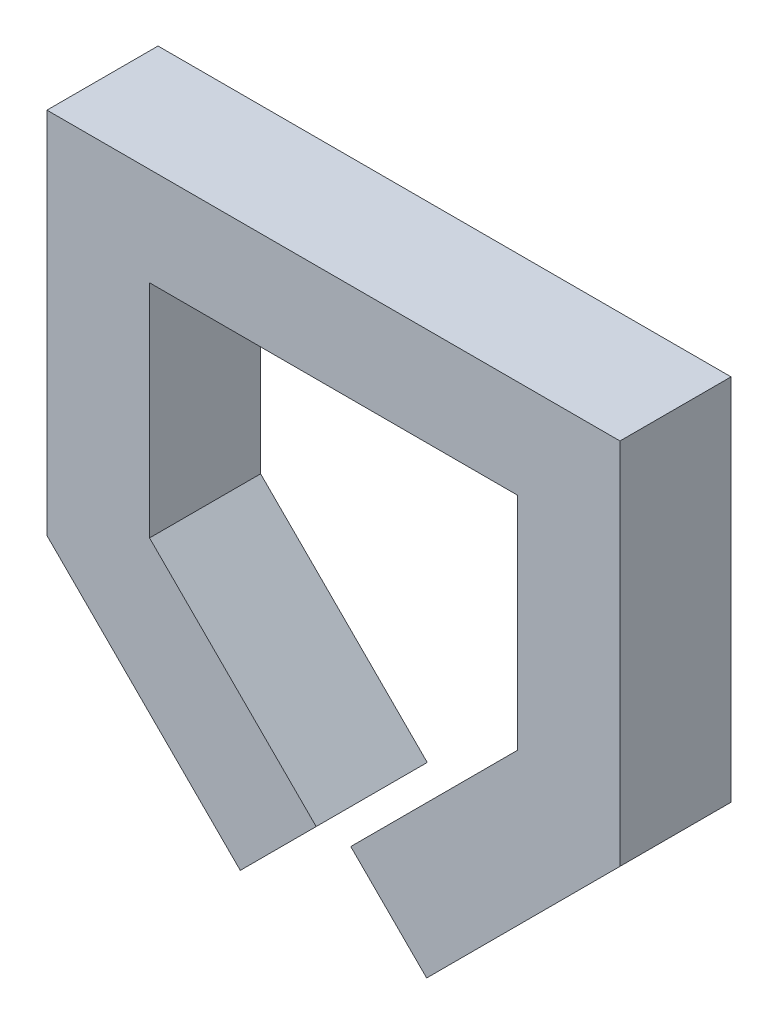
ISO-10303-21;
HEADER;
FILE_DESCRIPTION(('STEP AP214'),'2;1');
FILE_NAME('part.step','',(''),(''),'','','');
FILE_SCHEMA(('AUTOMOTIVE_DESIGN { 1 0 10303 214 1 1 1 1 }'));
ENDSEC;
DATA;
#1=APPLICATION_CONTEXT('core data for automotive mechanical design processes');
#2=APPLICATION_PROTOCOL_DEFINITION('international standard','automotive_design',2000,#1);
#3=PRODUCT_CONTEXT('',#1,'mechanical');
#4=PRODUCT('Part','Part','',(#3));
#5=PRODUCT_RELATED_PRODUCT_CATEGORY('part','',(#4));
#6=PRODUCT_DEFINITION_FORMATION('','',#4);
#7=PRODUCT_DEFINITION_CONTEXT('part definition',#1,'design');
#8=PRODUCT_DEFINITION('design','',#6,#7);
#9=PRODUCT_DEFINITION_SHAPE('','',#8);
#10=(LENGTH_UNIT() NAMED_UNIT(*) SI_UNIT(.MILLI.,.METRE.));
#11=(NAMED_UNIT(*) PLANE_ANGLE_UNIT() SI_UNIT($,.RADIAN.));
#12=(NAMED_UNIT(*) SI_UNIT($,.STERADIAN.) SOLID_ANGLE_UNIT());
#13=UNCERTAINTY_MEASURE_WITH_UNIT(LENGTH_MEASURE(1.E-05),#10,'distance_accuracy_value','');
#14=(GEOMETRIC_REPRESENTATION_CONTEXT(3) GLOBAL_UNCERTAINTY_ASSIGNED_CONTEXT((#13)) GLOBAL_UNIT_ASSIGNED_CONTEXT((#10,
#11,#12)) REPRESENTATION_CONTEXT('',''));
#15=CARTESIAN_POINT('',(0.,0.,0.));
#16=DIRECTION('',(0.,0.,1.));
#17=DIRECTION('',(1.,0.,0.));
#18=AXIS2_PLACEMENT_3D('',#15,#16,#17);
#19=CARTESIAN_POINT('',(86.4478070884838,-20.1310186947394,20.));
#20=DIRECTION('',(-1.,0.,0.));
#21=DIRECTION('',(0.,0.,1.));
#22=AXIS2_PLACEMENT_3D('',#19,#20,#21);
#23=PLANE('',#22);
#24=DIRECTION('',(0.,1.,0.));
#25=VECTOR('',#24,1.);
#26=CARTESIAN_POINT('',(86.4478070884838,-20.1310186947394,0.));
#27=LINE('',#26,#25);
#28=CARTESIAN_POINT('',(86.4478070884838,-20.1310186947394,0.));
#29=VERTEX_POINT('',#28);
#30=CARTESIAN_POINT('',(86.4478070884838,46.2157099251284,0.));
#31=VERTEX_POINT('',#30);
#32=EDGE_CURVE('E153',#29,#31,#27,.T.);
#33=ORIENTED_EDGE('',*,*,#32,.F.);
#34=DIRECTION('',(0.,0.,-1.));
#35=VECTOR('',#34,1.);
#36=CARTESIAN_POINT('',(86.4478070884838,-20.1310186947394,20.));
#37=LINE('',#36,#35);
#38=CARTESIAN_POINT('',(86.4478070884838,-20.1310186947394,20.));
#39=VERTEX_POINT('',#38);
#40=EDGE_CURVE('E11',#39,#29,#37,.T.);
#41=ORIENTED_EDGE('',*,*,#40,.F.);
#42=DIRECTION('',(0.,1.,0.));
#43=VECTOR('',#42,1.);
#44=CARTESIAN_POINT('',(86.4478070884838,-20.1310186947394,20.));
#45=LINE('',#44,#43);
#46=CARTESIAN_POINT('',(86.4478070884838,46.2157099251284,20.));
#47=VERTEX_POINT('',#46);
#48=EDGE_CURVE('E183',#39,#47,#45,.T.);
#49=ORIENTED_EDGE('',*,*,#48,.T.);
#50=DIRECTION('',(0.,0.,-1.));
#51=VECTOR('',#50,1.);
#52=CARTESIAN_POINT('',(86.4478070884838,46.2157099251284,20.));
#53=LINE('',#52,#51);
#54=EDGE_CURVE('E36',#47,#31,#53,.T.);
#55=ORIENTED_EDGE('',*,*,#54,.T.);
#56=EDGE_LOOP('',(#33,#41,#49,#55));
#57=FACE_BOUND('',#56,.T.);
#58=ADVANCED_FACE('F33',(#57),#23,.T.);
#59=CARTESIAN_POINT('',(121.262122634224,-54.9453342404804,20.));
#60=DIRECTION('',(-0.707106781186554,-0.707106781186541,0.));
#61=DIRECTION('',(0.707106781186541,-0.707106781186554,0.));
#62=AXIS2_PLACEMENT_3D('',#59,#60,#61);
#63=PLANE('',#62);
#64=DIRECTION('',(-0.707106781186541,0.707106781186554,0.));
#65=VECTOR('',#64,1.);
#66=CARTESIAN_POINT('',(121.262122634224,-54.9453342404804,0.));
#67=LINE('',#66,#65);
#68=CARTESIAN_POINT('',(121.262122634224,-54.9453342404804,0.));
#69=VERTEX_POINT('',#68);
#70=EDGE_CURVE('E181',#69,#29,#67,.T.);
#71=ORIENTED_EDGE('',*,*,#70,.F.);
#72=DIRECTION('',(0.,0.,-1.));
#73=VECTOR('',#72,1.);
#74=CARTESIAN_POINT('',(121.262122634224,-54.9453342404804,20.));
#75=LINE('',#74,#73);
#76=CARTESIAN_POINT('',(121.262122634224,-54.9453342404804,20.));
#77=VERTEX_POINT('',#76);
#78=EDGE_CURVE('E42',#77,#69,#75,.T.);
#79=ORIENTED_EDGE('',*,*,#78,.F.);
#80=DIRECTION('',(-0.707106781186541,0.707106781186554,0.));
#81=VECTOR('',#80,1.);
#82=CARTESIAN_POINT('',(121.262122634224,-54.9453342404804,20.));
#83=LINE('',#82,#81);
#84=EDGE_CURVE('E133',#77,#39,#83,.T.);
#85=ORIENTED_EDGE('',*,*,#84,.T.);
#86=ORIENTED_EDGE('',*,*,#40,.T.);
#87=EDGE_LOOP('',(#71,#79,#85,#86));
#88=FACE_BOUND('',#87,.T.);
#89=ADVANCED_FACE('F206',(#88),#63,.T.);
#90=CARTESIAN_POINT('',(121.262122634224,-54.9453342404804,20.));
#91=DIRECTION('',(-0.707106781186547,0.707106781186548,0.));
#92=DIRECTION('',(-0.707106781186548,-0.707106781186547,0.));
#93=AXIS2_PLACEMENT_3D('',#90,#91,#92);
#94=PLANE('',#93);
#95=DIRECTION('',(0.707106781186548,0.707106781186547,0.));
#96=VECTOR('',#95,1.);
#97=CARTESIAN_POINT('',(121.262122634224,-54.9453342404804,0.));
#98=LINE('',#97,#96);
#99=CARTESIAN_POINT('',(134.930162854027,-41.2772940206779,0.));
#100=VERTEX_POINT('',#99);
#101=EDGE_CURVE('E138',#69,#100,#98,.T.);
#102=ORIENTED_EDGE('',*,*,#101,.T.);
#103=DIRECTION('',(0.,0.,-1.));
#104=VECTOR('',#103,1.);
#105=CARTESIAN_POINT('',(134.930162854027,-41.2772940206779,20.));
#106=LINE('',#105,#104);
#107=CARTESIAN_POINT('',(134.930162854027,-41.2772940206779,20.));
#108=VERTEX_POINT('',#107);
#109=EDGE_CURVE('E136',#108,#100,#106,.T.);
#110=ORIENTED_EDGE('',*,*,#109,.F.);
#111=DIRECTION('',(0.707106781186548,0.707106781186547,0.));
#112=VECTOR('',#111,1.);
#113=CARTESIAN_POINT('',(121.262122634224,-54.9453342404804,20.));
#114=LINE('',#113,#112);
#115=EDGE_CURVE('E127',#77,#108,#114,.T.);
#116=ORIENTED_EDGE('',*,*,#115,.F.);
#117=ORIENTED_EDGE('',*,*,#78,.T.);
#118=EDGE_LOOP('',(#102,#110,#116,#117));
#119=FACE_BOUND('',#118,.T.);
#120=ADVANCED_FACE('F137',(#119),#94,.F.);
#121=CARTESIAN_POINT('',(134.930162854027,-41.2772940206779,20.));
#122=DIRECTION('',(-0.707106781186547,-0.707106781186548,0.));
#123=DIRECTION('',(0.707106781186548,-0.707106781186547,0.));
#124=AXIS2_PLACEMENT_3D('',#121,#122,#123);
#125=PLANE('',#124);
#126=DIRECTION('',(-0.707106781186548,0.707106781186547,0.));
#127=VECTOR('',#126,1.);
#128=CARTESIAN_POINT('',(134.930162854027,-41.2772940206779,0.));
#129=LINE('',#128,#127);
#130=CARTESIAN_POINT('',(104.920992701013,-11.2681238676647,0.));
#131=VERTEX_POINT('',#130);
#132=EDGE_CURVE('E178',#100,#131,#129,.T.);
#133=ORIENTED_EDGE('',*,*,#132,.T.);
#134=DIRECTION('',(0.,0.,-1.));
#135=VECTOR('',#134,1.);
#136=CARTESIAN_POINT('',(104.920992701013,-11.2681238676647,20.));
#137=LINE('',#136,#135);
#138=CARTESIAN_POINT('',(104.920992701013,-11.2681238676647,20.));
#139=VERTEX_POINT('',#138);
#140=EDGE_CURVE('E141',#139,#131,#137,.T.);
#141=ORIENTED_EDGE('',*,*,#140,.F.);
#142=DIRECTION('',(-0.707106781186548,0.707106781186547,0.));
#143=VECTOR('',#142,1.);
#144=CARTESIAN_POINT('',(134.930162854027,-41.2772940206779,20.));
#145=LINE('',#144,#143);
#146=EDGE_CURVE('E131',#108,#139,#145,.T.);
#147=ORIENTED_EDGE('',*,*,#146,.F.);
#148=ORIENTED_EDGE('',*,*,#109,.T.);
#149=EDGE_LOOP('',(#133,#141,#147,#148));
#150=FACE_BOUND('',#149,.T.);
#151=ADVANCED_FACE('F143',(#150),#125,.F.);
#152=CARTESIAN_POINT('',(104.920992701013,-11.2681238676647,20.));
#153=DIRECTION('',(-1.,0.,0.));
#154=DIRECTION('',(0.,0.,1.));
#155=AXIS2_PLACEMENT_3D('',#152,#153,#154);
#156=PLANE('',#155);
#157=DIRECTION('',(0.,1.,0.));
#158=VECTOR('',#157,1.);
#159=CARTESIAN_POINT('',(104.920992701013,-11.2681238676647,0.));
#160=LINE('',#159,#158);
#161=CARTESIAN_POINT('',(104.920992701013,28.5298559303157,0.));
#162=VERTEX_POINT('',#161);
#163=EDGE_CURVE('E176',#131,#162,#160,.T.);
#164=ORIENTED_EDGE('',*,*,#163,.T.);
#165=DIRECTION('',(0.,0.,-1.));
#166=VECTOR('',#165,1.);
#167=CARTESIAN_POINT('',(104.920992701013,28.5298559303157,20.));
#168=LINE('',#167,#166);
#169=CARTESIAN_POINT('',(104.920992701013,28.5298559303157,20.));
#170=VERTEX_POINT('',#169);
#171=EDGE_CURVE('E187',#170,#162,#168,.T.);
#172=ORIENTED_EDGE('',*,*,#171,.F.);
#173=DIRECTION('',(0.,1.,0.));
#174=VECTOR('',#173,1.);
#175=CARTESIAN_POINT('',(104.920992701013,-11.2681238676647,20.));
#176=LINE('',#175,#174);
#177=EDGE_CURVE('E146',#139,#170,#176,.T.);
#178=ORIENTED_EDGE('',*,*,#177,.F.);
#179=ORIENTED_EDGE('',*,*,#140,.T.);
#180=EDGE_LOOP('',(#164,#172,#178,#179));
#181=FACE_BOUND('',#180,.T.);
#182=ADVANCED_FACE('F219',(#181),#156,.F.);
#183=CARTESIAN_POINT('',(104.920992701013,28.5298559303157,20.));
#184=DIRECTION('',(0.,1.,0.));
#185=DIRECTION('',(-1.,0.,0.));
#186=AXIS2_PLACEMENT_3D('',#183,#184,#185);
#187=PLANE('',#186);
#188=DIRECTION('',(1.,0.,0.));
#189=VECTOR('',#188,1.);
#190=CARTESIAN_POINT('',(104.920992701013,28.5298559303157,0.));
#191=LINE('',#190,#189);
#192=CARTESIAN_POINT('',(171.166129255041,28.5298559303157,0.));
#193=VERTEX_POINT('',#192);
#194=EDGE_CURVE('E173',#162,#193,#191,.T.);
#195=ORIENTED_EDGE('',*,*,#194,.T.);
#196=DIRECTION('',(0.,0.,-1.));
#197=VECTOR('',#196,1.);
#198=CARTESIAN_POINT('',(171.166129255041,28.5298559303157,20.));
#199=LINE('',#198,#197);
#200=CARTESIAN_POINT('',(171.166129255041,28.5298559303157,20.));
#201=VERTEX_POINT('',#200);
#202=EDGE_CURVE('E190',#201,#193,#199,.T.);
#203=ORIENTED_EDGE('',*,*,#202,.F.);
#204=DIRECTION('',(1.,0.,0.));
#205=VECTOR('',#204,1.);
#206=CARTESIAN_POINT('',(104.920992701013,28.5298559303157,20.));
#207=LINE('',#206,#205);
#208=EDGE_CURVE('E148',#170,#201,#207,.T.);
#209=ORIENTED_EDGE('',*,*,#208,.F.);
#210=ORIENTED_EDGE('',*,*,#171,.T.);
#211=EDGE_LOOP('',(#195,#203,#209,#210));
#212=FACE_BOUND('',#211,.T.);
#213=ADVANCED_FACE('F222',(#212),#187,.F.);
#214=CARTESIAN_POINT('',(171.166129255041,-11.2681238676647,20.));
#215=DIRECTION('',(-1.,0.,0.));
#216=DIRECTION('',(0.,0.,1.));
#217=AXIS2_PLACEMENT_3D('',#214,#215,#216);
#218=PLANE('',#217);
#219=DIRECTION('',(0.,1.,0.));
#220=VECTOR('',#219,1.);
#221=CARTESIAN_POINT('',(171.166129255041,-11.2681238676647,0.));
#222=LINE('',#221,#220);
#223=CARTESIAN_POINT('',(171.166129255041,-11.2681238676647,0.));
#224=VERTEX_POINT('',#223);
#225=EDGE_CURVE('E170',#224,#193,#222,.T.);
#226=ORIENTED_EDGE('',*,*,#225,.F.);
#227=DIRECTION('',(0.,0.,-1.));
#228=VECTOR('',#227,1.);
#229=CARTESIAN_POINT('',(171.166129255041,-11.2681238676647,20.));
#230=LINE('',#229,#228);
#231=CARTESIAN_POINT('',(171.166129255041,-11.2681238676647,20.));
#232=VERTEX_POINT('',#231);
#233=EDGE_CURVE('E192',#232,#224,#230,.T.);
#234=ORIENTED_EDGE('',*,*,#233,.F.);
#235=DIRECTION('',(0.,1.,0.));
#236=VECTOR('',#235,1.);
#237=CARTESIAN_POINT('',(171.166129255041,-11.2681238676647,20.));
#238=LINE('',#237,#236);
#239=EDGE_CURVE('E348',#232,#201,#238,.T.);
#240=ORIENTED_EDGE('',*,*,#239,.T.);
#241=ORIENTED_EDGE('',*,*,#202,.T.);
#242=EDGE_LOOP('',(#226,#234,#240,#241));
#243=FACE_BOUND('',#242,.T.);
#244=ADVANCED_FACE('F226',(#243),#218,.T.);
#245=CARTESIAN_POINT('',(141.156959102028,-41.2772940206779,20.));
#246=DIRECTION('',(-0.707106781186547,0.707106781186548,0.));
#247=DIRECTION('',(-0.707106781186548,-0.707106781186547,0.));
#248=AXIS2_PLACEMENT_3D('',#245,#246,#247);
#249=PLANE('',#248);
#250=DIRECTION('',(0.707106781186548,0.707106781186547,0.));
#251=VECTOR('',#250,1.);
#252=CARTESIAN_POINT('',(141.156959102028,-41.2772940206779,0.));
#253=LINE('',#252,#251);
#254=CARTESIAN_POINT('',(141.156959102028,-41.2772940206779,0.));
#255=VERTEX_POINT('',#254);
#256=EDGE_CURVE('E167',#255,#224,#253,.T.);
#257=ORIENTED_EDGE('',*,*,#256,.F.);
#258=DIRECTION('',(0.,0.,-1.));
#259=VECTOR('',#258,1.);
#260=CARTESIAN_POINT('',(141.156959102028,-41.2772940206779,20.));
#261=LINE('',#260,#259);
#262=CARTESIAN_POINT('',(141.156959102028,-41.2772940206779,20.));
#263=VERTEX_POINT('',#262);
#264=EDGE_CURVE('E194',#263,#255,#261,.T.);
#265=ORIENTED_EDGE('',*,*,#264,.F.);
#266=DIRECTION('',(0.707106781186548,0.707106781186547,0.));
#267=VECTOR('',#266,1.);
#268=CARTESIAN_POINT('',(141.156959102028,-41.2772940206779,20.));
#269=LINE('',#268,#267);
#270=EDGE_CURVE('E351',#263,#232,#269,.T.);
#271=ORIENTED_EDGE('',*,*,#270,.T.);
#272=ORIENTED_EDGE('',*,*,#233,.T.);
#273=EDGE_LOOP('',(#257,#265,#271,#272));
#274=FACE_BOUND('',#273,.T.);
#275=ADVANCED_FACE('F230',(#274),#249,.T.);
#276=CARTESIAN_POINT('',(154.82499932183,-54.9453342404801,20.));
#277=DIRECTION('',(-0.707106781186547,-0.707106781186548,0.));
#278=DIRECTION('',(0.707106781186548,-0.707106781186547,0.));
#279=AXIS2_PLACEMENT_3D('',#276,#277,#278);
#280=PLANE('',#279);
#281=DIRECTION('',(-0.707106781186548,0.707106781186547,0.));
#282=VECTOR('',#281,1.);
#283=CARTESIAN_POINT('',(154.82499932183,-54.9453342404801,0.));
#284=LINE('',#283,#282);
#285=CARTESIAN_POINT('',(154.82499932183,-54.9453342404801,0.));
#286=VERTEX_POINT('',#285);
#287=EDGE_CURVE('E164',#286,#255,#284,.T.);
#288=ORIENTED_EDGE('',*,*,#287,.F.);
#289=DIRECTION('',(0.,0.,-1.));
#290=VECTOR('',#289,1.);
#291=CARTESIAN_POINT('',(154.82499932183,-54.9453342404801,20.));
#292=LINE('',#291,#290);
#293=CARTESIAN_POINT('',(154.82499932183,-54.9453342404801,20.));
#294=VERTEX_POINT('',#293);
#295=EDGE_CURVE('E196',#294,#286,#292,.T.);
#296=ORIENTED_EDGE('',*,*,#295,.F.);
#297=DIRECTION('',(-0.707106781186548,0.707106781186547,0.));
#298=VECTOR('',#297,1.);
#299=CARTESIAN_POINT('',(154.82499932183,-54.9453342404801,20.));
#300=LINE('',#299,#298);
#301=EDGE_CURVE('E339',#294,#263,#300,.T.);
#302=ORIENTED_EDGE('',*,*,#301,.T.);
#303=ORIENTED_EDGE('',*,*,#264,.T.);
#304=EDGE_LOOP('',(#288,#296,#302,#303));
#305=FACE_BOUND('',#304,.T.);
#306=ADVANCED_FACE('F234',(#305),#280,.T.);
#307=CARTESIAN_POINT('',(154.82499932183,-54.9453342404801,20.));
#308=DIRECTION('',(-0.707106781186548,0.707106781186547,0.));
#309=DIRECTION('',(-0.707106781186547,-0.707106781186548,0.));
#310=AXIS2_PLACEMENT_3D('',#307,#308,#309);
#311=PLANE('',#310);
#312=DIRECTION('',(0.707106781186547,0.707106781186548,0.));
#313=VECTOR('',#312,1.);
#314=CARTESIAN_POINT('',(154.82499932183,-54.9453342404801,0.));
#315=LINE('',#314,#313);
#316=CARTESIAN_POINT('',(189.639314867571,-20.1310186947394,0.));
#317=VERTEX_POINT('',#316);
#318=EDGE_CURVE('E162',#286,#317,#315,.T.);
#319=ORIENTED_EDGE('',*,*,#318,.T.);
#320=DIRECTION('',(0.,0.,-1.));
#321=VECTOR('',#320,1.);
#322=CARTESIAN_POINT('',(189.639314867571,-20.1310186947394,20.));
#323=LINE('',#322,#321);
#324=CARTESIAN_POINT('',(189.639314867571,-20.1310186947394,20.));
#325=VERTEX_POINT('',#324);
#326=EDGE_CURVE('E198',#325,#317,#323,.T.);
#327=ORIENTED_EDGE('',*,*,#326,.F.);
#328=DIRECTION('',(0.707106781186547,0.707106781186548,0.));
#329=VECTOR('',#328,1.);
#330=CARTESIAN_POINT('',(154.82499932183,-54.9453342404801,20.));
#331=LINE('',#330,#329);
#332=EDGE_CURVE('E356',#294,#325,#331,.T.);
#333=ORIENTED_EDGE('',*,*,#332,.F.);
#334=ORIENTED_EDGE('',*,*,#295,.T.);
#335=EDGE_LOOP('',(#319,#327,#333,#334));
#336=FACE_BOUND('',#335,.T.);
#337=ADVANCED_FACE('F238',(#336),#311,.F.);
#338=CARTESIAN_POINT('',(189.639314867571,-20.1310186947394,20.));
#339=DIRECTION('',(-1.,0.,0.));
#340=DIRECTION('',(0.,0.,1.));
#341=AXIS2_PLACEMENT_3D('',#338,#339,#340);
#342=PLANE('',#341);
#343=DIRECTION('',(0.,1.,0.));
#344=VECTOR('',#343,1.);
#345=CARTESIAN_POINT('',(189.639314867571,-20.1310186947394,0.));
#346=LINE('',#345,#344);
#347=CARTESIAN_POINT('',(189.639314867571,46.2157099251284,0.));
#348=VERTEX_POINT('',#347);
#349=EDGE_CURVE('E159',#317,#348,#346,.T.);
#350=ORIENTED_EDGE('',*,*,#349,.T.);
#351=DIRECTION('',(0.,0.,-1.));
#352=VECTOR('',#351,1.);
#353=CARTESIAN_POINT('',(189.639314867571,46.2157099251284,20.));
#354=LINE('',#353,#352);
#355=CARTESIAN_POINT('',(189.639314867571,46.2157099251284,20.));
#356=VERTEX_POINT('',#355);
#357=EDGE_CURVE('E200',#356,#348,#354,.T.);
#358=ORIENTED_EDGE('',*,*,#357,.F.);
#359=DIRECTION('',(0.,1.,0.));
#360=VECTOR('',#359,1.);
#361=CARTESIAN_POINT('',(189.639314867571,-20.1310186947394,20.));
#362=LINE('',#361,#360);
#363=EDGE_CURVE('E358',#325,#356,#362,.T.);
#364=ORIENTED_EDGE('',*,*,#363,.F.);
#365=ORIENTED_EDGE('',*,*,#326,.T.);
#366=EDGE_LOOP('',(#350,#358,#364,#365));
#367=FACE_BOUND('',#366,.T.);
#368=ADVANCED_FACE('F242',(#367),#342,.F.);
#369=CARTESIAN_POINT('',(86.4478070884838,46.2157099251284,20.));
#370=DIRECTION('',(0.,1.,0.));
#371=DIRECTION('',(-1.,0.,0.));
#372=AXIS2_PLACEMENT_3D('',#369,#370,#371);
#373=PLANE('',#372);
#374=DIRECTION('',(1.,0.,0.));
#375=VECTOR('',#374,1.);
#376=CARTESIAN_POINT('',(86.4478070884838,46.2157099251284,0.));
#377=LINE('',#376,#375);
#378=EDGE_CURVE('E156',#31,#348,#377,.T.);
#379=ORIENTED_EDGE('',*,*,#378,.F.);
#380=ORIENTED_EDGE('',*,*,#54,.F.);
#381=DIRECTION('',(1.,0.,0.));
#382=VECTOR('',#381,1.);
#383=CARTESIAN_POINT('',(86.4478070884838,46.2157099251284,20.));
#384=LINE('',#383,#382);
#385=EDGE_CURVE('E360',#47,#356,#384,.T.);
#386=ORIENTED_EDGE('',*,*,#385,.T.);
#387=ORIENTED_EDGE('',*,*,#357,.T.);
#388=EDGE_LOOP('',(#379,#380,#386,#387));
#389=FACE_BOUND('',#388,.T.);
#390=ADVANCED_FACE('F202',(#389),#373,.T.);
#391=CARTESIAN_POINT('',(0.,0.,20.));
#392=DIRECTION('',(0.,0.,-1.));
#393=DIRECTION('',(-1.,0.,0.));
#394=AXIS2_PLACEMENT_3D('',#391,#392,#393);
#395=PLANE('',#394);
#396=ORIENTED_EDGE('',*,*,#48,.F.);
#397=ORIENTED_EDGE('',*,*,#84,.F.);
#398=ORIENTED_EDGE('',*,*,#115,.T.);
#399=ORIENTED_EDGE('',*,*,#146,.T.);
#400=ORIENTED_EDGE('',*,*,#177,.T.);
#401=ORIENTED_EDGE('',*,*,#208,.T.);
#402=ORIENTED_EDGE('',*,*,#239,.F.);
#403=ORIENTED_EDGE('',*,*,#270,.F.);
#404=ORIENTED_EDGE('',*,*,#301,.F.);
#405=ORIENTED_EDGE('',*,*,#332,.T.);
#406=ORIENTED_EDGE('',*,*,#363,.T.);
#407=ORIENTED_EDGE('',*,*,#385,.F.);
#408=EDGE_LOOP('',(#396,#397,#398,#399,#400,#401,#402,#403,#404,#405,#406,#407));
#409=FACE_BOUND('',#408,.T.);
#410=ADVANCED_FACE('F129',(#409),#395,.F.);
#411=CARTESIAN_POINT('',(0.,0.,0.));
#412=DIRECTION('',(0.,0.,-1.));
#413=DIRECTION('',(-1.,0.,0.));
#414=AXIS2_PLACEMENT_3D('',#411,#412,#413);
#415=PLANE('',#414);
#416=ORIENTED_EDGE('',*,*,#32,.T.);
#417=ORIENTED_EDGE('',*,*,#378,.T.);
#418=ORIENTED_EDGE('',*,*,#349,.F.);
#419=ORIENTED_EDGE('',*,*,#318,.F.);
#420=ORIENTED_EDGE('',*,*,#287,.T.);
#421=ORIENTED_EDGE('',*,*,#256,.T.);
#422=ORIENTED_EDGE('',*,*,#225,.T.);
#423=ORIENTED_EDGE('',*,*,#194,.F.);
#424=ORIENTED_EDGE('',*,*,#163,.F.);
#425=ORIENTED_EDGE('',*,*,#132,.F.);
#426=ORIENTED_EDGE('',*,*,#101,.F.);
#427=ORIENTED_EDGE('',*,*,#70,.T.);
#428=EDGE_LOOP('',(#416,#417,#418,#419,#420,#421,#422,#423,#424,#425,#426,#427));
#429=FACE_BOUND('',#428,.T.);
#430=ADVANCED_FACE('F205',(#429),#415,.T.);
#431=CLOSED_SHELL('',(#58,#89,#120,#151,#182,#213,#244,#275,#306,#337,#368,#390,#410,#430));
#432=MANIFOLD_SOLID_BREP('B2',#431);
#433=ADVANCED_BREP_SHAPE_REPRESENTATION('',(#18,#432),#14);
#434=SHAPE_DEFINITION_REPRESENTATION(#9,#433);
ENDSEC;
END-ISO-10303-21;
